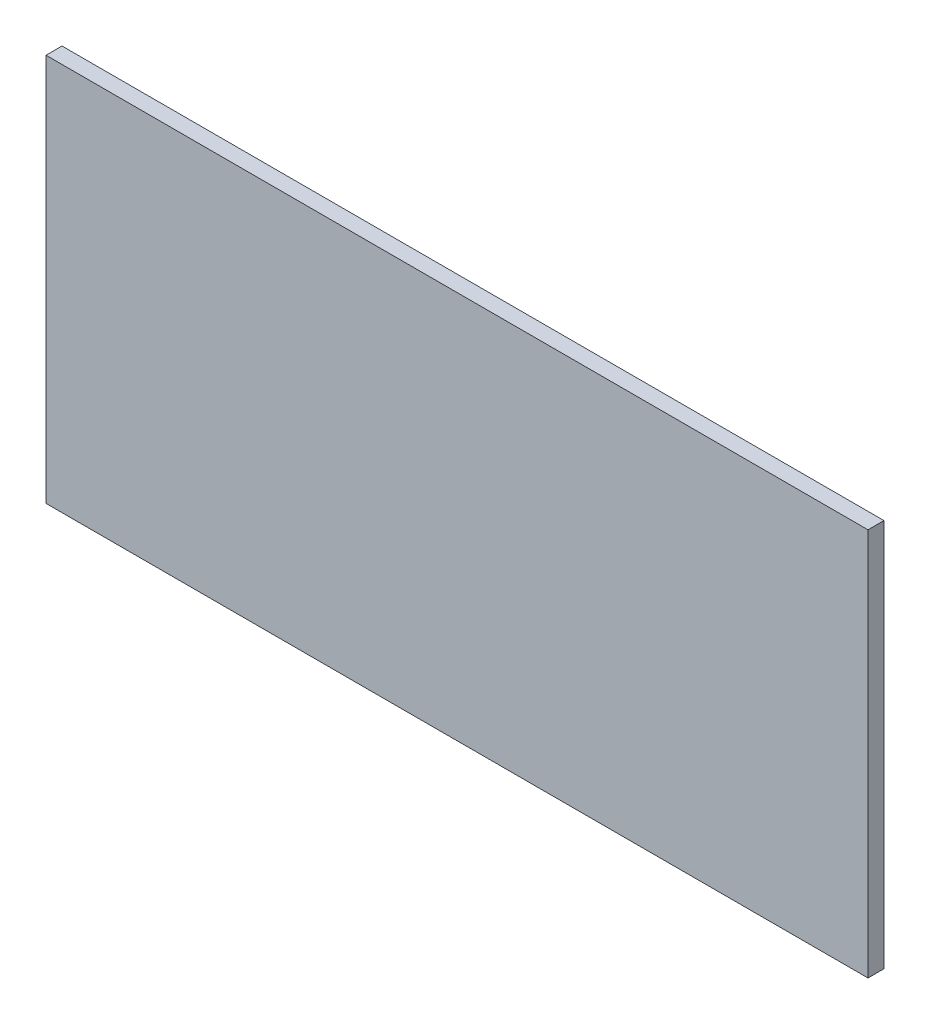
ISO-10303-21;
HEADER;
FILE_DESCRIPTION(('STEP AP214'),'2;1');
FILE_NAME('part.step','',(''),(''),'','','');
FILE_SCHEMA(('AUTOMOTIVE_DESIGN { 1 0 10303 214 1 1 1 1 }'));
ENDSEC;
DATA;
#1=APPLICATION_CONTEXT('core data for automotive mechanical design processes');
#2=APPLICATION_PROTOCOL_DEFINITION('international standard','automotive_design',2000,#1);
#3=PRODUCT_CONTEXT('',#1,'mechanical');
#4=PRODUCT('Part','Part','',(#3));
#5=PRODUCT_RELATED_PRODUCT_CATEGORY('part','',(#4));
#6=PRODUCT_DEFINITION_FORMATION('','',#4);
#7=PRODUCT_DEFINITION_CONTEXT('part definition',#1,'design');
#8=PRODUCT_DEFINITION('design','',#6,#7);
#9=PRODUCT_DEFINITION_SHAPE('','',#8);
#10=(LENGTH_UNIT() NAMED_UNIT(*) SI_UNIT(.MILLI.,.METRE.));
#11=(NAMED_UNIT(*) PLANE_ANGLE_UNIT() SI_UNIT($,.RADIAN.));
#12=(NAMED_UNIT(*) SI_UNIT($,.STERADIAN.) SOLID_ANGLE_UNIT());
#13=UNCERTAINTY_MEASURE_WITH_UNIT(LENGTH_MEASURE(1.E-05),#10,'distance_accuracy_value','');
#14=(GEOMETRIC_REPRESENTATION_CONTEXT(3) GLOBAL_UNCERTAINTY_ASSIGNED_CONTEXT((#13)) GLOBAL_UNIT_ASSIGNED_CONTEXT((#10,
#11,#12)) REPRESENTATION_CONTEXT('',''));
#15=CARTESIAN_POINT('',(0.,0.,0.));
#16=DIRECTION('',(0.,0.,1.));
#17=DIRECTION('',(1.,0.,0.));
#18=AXIS2_PLACEMENT_3D('',#15,#16,#17);
#19=CARTESIAN_POINT('',(888.3,739.75,0.));
#20=DIRECTION('',(-1.,0.,0.));
#21=DIRECTION('',(0.,1.,0.));
#22=AXIS2_PLACEMENT_3D('',#19,#20,#21);
#23=PLANE('',#22);
#24=DIRECTION('',(0.,1.,0.));
#25=VECTOR('',#24,1.);
#26=CARTESIAN_POINT('',(888.3,739.75,0.0350012));
#27=LINE('',#26,#25);
#28=CARTESIAN_POINT('',(888.3,739.75,0.0350012));
#29=VERTEX_POINT('',#28);
#30=CARTESIAN_POINT('',(888.3,740.6,0.0350012));
#31=VERTEX_POINT('',#30);
#32=EDGE_CURVE('E11',#29,#31,#27,.T.);
#33=ORIENTED_EDGE('',*,*,#32,.F.);
#34=DIRECTION('',(0.,0.,1.));
#35=VECTOR('',#34,1.);
#36=CARTESIAN_POINT('',(888.3,739.75,0.));
#37=LINE('',#36,#35);
#38=CARTESIAN_POINT('',(888.3,739.75,0.));
#39=VERTEX_POINT('',#38);
#40=EDGE_CURVE('E24',#39,#29,#37,.T.);
#41=ORIENTED_EDGE('',*,*,#40,.F.);
#42=DIRECTION('',(0.,1.,0.));
#43=VECTOR('',#42,1.);
#44=CARTESIAN_POINT('',(888.3,739.75,0.));
#45=LINE('',#44,#43);
#46=CARTESIAN_POINT('',(888.3,740.6,0.));
#47=VERTEX_POINT('',#46);
#48=EDGE_CURVE('E75',#39,#47,#45,.T.);
#49=ORIENTED_EDGE('',*,*,#48,.T.);
#50=DIRECTION('',(0.,0.,1.));
#51=VECTOR('',#50,1.);
#52=CARTESIAN_POINT('',(888.3,740.6,0.));
#53=LINE('',#52,#51);
#54=EDGE_CURVE('E37',#47,#31,#53,.T.);
#55=ORIENTED_EDGE('',*,*,#54,.T.);
#56=EDGE_LOOP('',(#33,#41,#49,#55));
#57=FACE_BOUND('',#56,.T.);
#58=ADVANCED_FACE('F17',(#57),#23,.F.);
#59=CARTESIAN_POINT('',(888.3,740.6,0.));
#60=DIRECTION('',(0.,-1.,0.));
#61=DIRECTION('',(-1.,0.,0.));
#62=AXIS2_PLACEMENT_3D('',#59,#60,#61);
#63=PLANE('',#62);
#64=DIRECTION('',(-1.,0.,0.));
#65=VECTOR('',#64,1.);
#66=CARTESIAN_POINT('',(888.3,740.6,0.0350012));
#67=LINE('',#66,#65);
#68=CARTESIAN_POINT('',(886.5,740.6,0.0350012));
#69=VERTEX_POINT('',#68);
#70=EDGE_CURVE('E83',#31,#69,#67,.T.);
#71=ORIENTED_EDGE('',*,*,#70,.F.);
#72=ORIENTED_EDGE('',*,*,#54,.F.);
#73=DIRECTION('',(-1.,0.,0.));
#74=VECTOR('',#73,1.);
#75=CARTESIAN_POINT('',(888.3,740.6,0.));
#76=LINE('',#75,#74);
#77=CARTESIAN_POINT('',(886.5,740.6,0.));
#78=VERTEX_POINT('',#77);
#79=EDGE_CURVE('E81',#47,#78,#76,.T.);
#80=ORIENTED_EDGE('',*,*,#79,.T.);
#81=DIRECTION('',(0.,0.,1.));
#82=VECTOR('',#81,1.);
#83=CARTESIAN_POINT('',(886.5,740.6,0.));
#84=LINE('',#83,#82);
#85=EDGE_CURVE('E67',#78,#69,#84,.T.);
#86=ORIENTED_EDGE('',*,*,#85,.T.);
#87=EDGE_LOOP('',(#71,#72,#80,#86));
#88=FACE_BOUND('',#87,.T.);
#89=ADVANCED_FACE('F89',(#88),#63,.F.);
#90=CARTESIAN_POINT('',(886.5,740.6,0.));
#91=DIRECTION('',(1.,0.,0.));
#92=DIRECTION('',(0.,-1.,0.));
#93=AXIS2_PLACEMENT_3D('',#90,#91,#92);
#94=PLANE('',#93);
#95=DIRECTION('',(0.,-1.,0.));
#96=VECTOR('',#95,1.);
#97=CARTESIAN_POINT('',(886.5,740.6,0.0350012));
#98=LINE('',#97,#96);
#99=CARTESIAN_POINT('',(886.5,739.75,0.0350012));
#100=VERTEX_POINT('',#99);
#101=EDGE_CURVE('E71',#69,#100,#98,.T.);
#102=ORIENTED_EDGE('',*,*,#101,.F.);
#103=ORIENTED_EDGE('',*,*,#85,.F.);
#104=DIRECTION('',(0.,-1.,0.));
#105=VECTOR('',#104,1.);
#106=CARTESIAN_POINT('',(886.5,740.6,0.));
#107=LINE('',#106,#105);
#108=CARTESIAN_POINT('',(886.5,739.75,0.));
#109=VERTEX_POINT('',#108);
#110=EDGE_CURVE('E63',#78,#109,#107,.T.);
#111=ORIENTED_EDGE('',*,*,#110,.T.);
#112=DIRECTION('',(0.,0.,1.));
#113=VECTOR('',#112,1.);
#114=CARTESIAN_POINT('',(886.5,739.75,0.));
#115=LINE('',#114,#113);
#116=EDGE_CURVE('E53',#109,#100,#115,.T.);
#117=ORIENTED_EDGE('',*,*,#116,.T.);
#118=EDGE_LOOP('',(#102,#103,#111,#117));
#119=FACE_BOUND('',#118,.T.);
#120=ADVANCED_FACE('F66',(#119),#94,.F.);
#121=CARTESIAN_POINT('',(886.5,739.75,0.));
#122=DIRECTION('',(0.,1.,0.));
#123=DIRECTION('',(1.,0.,0.));
#124=AXIS2_PLACEMENT_3D('',#121,#122,#123);
#125=PLANE('',#124);
#126=DIRECTION('',(1.,0.,0.));
#127=VECTOR('',#126,1.);
#128=CARTESIAN_POINT('',(886.5,739.75,0.0350012));
#129=LINE('',#128,#127);
#130=EDGE_CURVE('E59',#100,#29,#129,.T.);
#131=ORIENTED_EDGE('',*,*,#130,.F.);
#132=ORIENTED_EDGE('',*,*,#116,.F.);
#133=DIRECTION('',(1.,0.,0.));
#134=VECTOR('',#133,1.);
#135=CARTESIAN_POINT('',(886.5,739.75,0.));
#136=LINE('',#135,#134);
#137=EDGE_CURVE('E57',#109,#39,#136,.T.);
#138=ORIENTED_EDGE('',*,*,#137,.T.);
#139=ORIENTED_EDGE('',*,*,#40,.T.);
#140=EDGE_LOOP('',(#131,#132,#138,#139));
#141=FACE_BOUND('',#140,.T.);
#142=ADVANCED_FACE('F55',(#141),#125,.F.);
#143=CARTESIAN_POINT('',(887.4,740.175,0.));
#144=DIRECTION('',(0.,0.,1.));
#145=DIRECTION('',(1.,0.,0.));
#146=AXIS2_PLACEMENT_3D('',#143,#144,#145);
#147=PLANE('',#146);
#148=ORIENTED_EDGE('',*,*,#137,.F.);
#149=ORIENTED_EDGE('',*,*,#110,.F.);
#150=ORIENTED_EDGE('',*,*,#79,.F.);
#151=ORIENTED_EDGE('',*,*,#48,.F.);
#152=EDGE_LOOP('',(#148,#149,#150,#151));
#153=FACE_BOUND('',#152,.T.);
#154=ADVANCED_FACE('F74',(#153),#147,.F.);
#155=CARTESIAN_POINT('',(887.4,740.175,0.0350012));
#156=DIRECTION('',(0.,0.,1.));
#157=DIRECTION('',(1.,0.,0.));
#158=AXIS2_PLACEMENT_3D('',#155,#156,#157);
#159=PLANE('',#158);
#160=ORIENTED_EDGE('',*,*,#32,.T.);
#161=ORIENTED_EDGE('',*,*,#70,.T.);
#162=ORIENTED_EDGE('',*,*,#101,.T.);
#163=ORIENTED_EDGE('',*,*,#130,.T.);
#164=EDGE_LOOP('',(#160,#161,#162,#163));
#165=FACE_BOUND('',#164,.T.);
#166=ADVANCED_FACE('F91',(#165),#159,.T.);
#167=CLOSED_SHELL('',(#58,#89,#120,#142,#154,#166));
#168=MANIFOLD_SOLID_BREP('B1',#167);
#169=ADVANCED_BREP_SHAPE_REPRESENTATION('',(#18,#168),#14);
#170=SHAPE_DEFINITION_REPRESENTATION(#9,#169);
ENDSEC;
END-ISO-10303-21;
